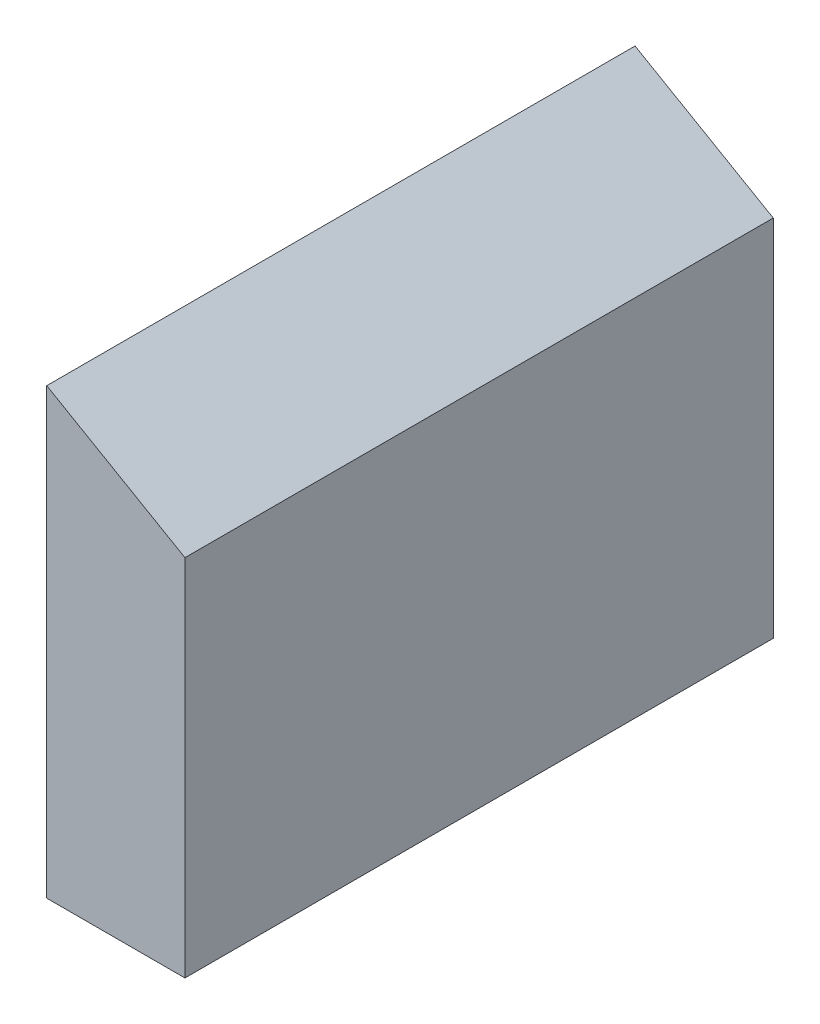
ISO-10303-21;
HEADER;
FILE_DESCRIPTION(('STEP AP214'),'2;1');
FILE_NAME('part.step','',(''),(''),'','','');
FILE_SCHEMA(('AUTOMOTIVE_DESIGN { 1 0 10303 214 1 1 1 1 }'));
ENDSEC;
DATA;
#1=APPLICATION_CONTEXT('core data for automotive mechanical design processes');
#2=APPLICATION_PROTOCOL_DEFINITION('international standard','automotive_design',2000,#1);
#3=PRODUCT_CONTEXT('',#1,'mechanical');
#4=PRODUCT('Part','Part','',(#3));
#5=PRODUCT_RELATED_PRODUCT_CATEGORY('part','',(#4));
#6=PRODUCT_DEFINITION_FORMATION('','',#4);
#7=PRODUCT_DEFINITION_CONTEXT('part definition',#1,'design');
#8=PRODUCT_DEFINITION('design','',#6,#7);
#9=PRODUCT_DEFINITION_SHAPE('','',#8);
#10=(LENGTH_UNIT() NAMED_UNIT(*) SI_UNIT(.MILLI.,.METRE.));
#11=(NAMED_UNIT(*) PLANE_ANGLE_UNIT() SI_UNIT($,.RADIAN.));
#12=(NAMED_UNIT(*) SI_UNIT($,.STERADIAN.) SOLID_ANGLE_UNIT());
#13=UNCERTAINTY_MEASURE_WITH_UNIT(LENGTH_MEASURE(1.E-05),#10,'distance_accuracy_value','');
#14=(GEOMETRIC_REPRESENTATION_CONTEXT(3) GLOBAL_UNCERTAINTY_ASSIGNED_CONTEXT((#13)) GLOBAL_UNIT_ASSIGNED_CONTEXT((#10,
#11,#12)) REPRESENTATION_CONTEXT('',''));
#15=CARTESIAN_POINT('',(0.,0.,0.));
#16=DIRECTION('',(0.,0.,1.));
#17=DIRECTION('',(1.,0.,0.));
#18=AXIS2_PLACEMENT_3D('',#15,#16,#17);
#19=CARTESIAN_POINT('',(0.,0.,42.57));
#20=DIRECTION('',(1.,0.,0.));
#21=DIRECTION('',(0.,0.,-1.));
#22=AXIS2_PLACEMENT_3D('',#19,#20,#21);
#23=PLANE('',#22);
#24=DIRECTION('',(0.,-1.,0.));
#25=VECTOR('',#24,1.);
#26=CARTESIAN_POINT('',(0.,0.,0.));
#27=LINE('',#26,#25);
#28=CARTESIAN_POINT('',(0.,32.118,0.));
#29=VERTEX_POINT('',#28);
#30=CARTESIAN_POINT('',(0.,0.,0.));
#31=VERTEX_POINT('',#30);
#32=EDGE_CURVE('E111',#29,#31,#27,.T.);
#33=ORIENTED_EDGE('',*,*,#32,.T.);
#34=DIRECTION('',(0.,0.,-1.));
#35=VECTOR('',#34,1.);
#36=CARTESIAN_POINT('',(0.,0.,42.57));
#37=LINE('',#36,#35);
#38=CARTESIAN_POINT('',(0.,0.,42.57));
#39=VERTEX_POINT('',#38);
#40=EDGE_CURVE('E11',#39,#31,#37,.T.);
#41=ORIENTED_EDGE('',*,*,#40,.F.);
#42=DIRECTION('',(0.,-1.,0.));
#43=VECTOR('',#42,1.);
#44=CARTESIAN_POINT('',(0.,0.,42.57));
#45=LINE('',#44,#43);
#46=CARTESIAN_POINT('',(0.,32.118,42.57));
#47=VERTEX_POINT('',#46);
#48=EDGE_CURVE('E95',#47,#39,#45,.T.);
#49=ORIENTED_EDGE('',*,*,#48,.F.);
#50=DIRECTION('',(0.,0.,-1.));
#51=VECTOR('',#50,1.);
#52=CARTESIAN_POINT('',(0.,32.118,42.57));
#53=LINE('',#52,#51);
#54=EDGE_CURVE('E107',#47,#29,#53,.T.);
#55=ORIENTED_EDGE('',*,*,#54,.T.);
#56=EDGE_LOOP('',(#33,#41,#49,#55));
#57=FACE_BOUND('',#56,.T.);
#58=ADVANCED_FACE('F43',(#57),#23,.F.);
#59=CARTESIAN_POINT('',(0.,0.,42.57));
#60=DIRECTION('',(0.,1.,0.));
#61=DIRECTION('',(0.,0.,1.));
#62=AXIS2_PLACEMENT_3D('',#59,#60,#61);
#63=PLANE('',#62);
#64=DIRECTION('',(1.,0.,0.));
#65=VECTOR('',#64,1.);
#66=CARTESIAN_POINT('',(0.,0.,0.));
#67=LINE('',#66,#65);
#68=CARTESIAN_POINT('',(10.,0.,0.));
#69=VERTEX_POINT('',#68);
#70=EDGE_CURVE('E100',#31,#69,#67,.T.);
#71=ORIENTED_EDGE('',*,*,#70,.T.);
#72=DIRECTION('',(0.,0.,-1.));
#73=VECTOR('',#72,1.);
#74=CARTESIAN_POINT('',(10.,0.,42.57));
#75=LINE('',#74,#73);
#76=CARTESIAN_POINT('',(10.,0.,42.57));
#77=VERTEX_POINT('',#76);
#78=EDGE_CURVE('E52',#77,#69,#75,.T.);
#79=ORIENTED_EDGE('',*,*,#78,.F.);
#80=DIRECTION('',(1.,0.,0.));
#81=VECTOR('',#80,1.);
#82=CARTESIAN_POINT('',(0.,0.,42.57));
#83=LINE('',#82,#81);
#84=EDGE_CURVE('E90',#39,#77,#83,.T.);
#85=ORIENTED_EDGE('',*,*,#84,.F.);
#86=ORIENTED_EDGE('',*,*,#40,.T.);
#87=EDGE_LOOP('',(#71,#79,#85,#86));
#88=FACE_BOUND('',#87,.T.);
#89=ADVANCED_FACE('F99',(#88),#63,.F.);
#90=CARTESIAN_POINT('',(10.,26.34,42.57));
#91=DIRECTION('',(-1.,0.,0.));
#92=DIRECTION('',(0.,0.,1.));
#93=AXIS2_PLACEMENT_3D('',#90,#91,#92);
#94=PLANE('',#93);
#95=DIRECTION('',(0.,1.,0.));
#96=VECTOR('',#95,1.);
#97=CARTESIAN_POINT('',(10.,26.34,0.));
#98=LINE('',#97,#96);
#99=CARTESIAN_POINT('',(10.,26.34,0.));
#100=VERTEX_POINT('',#99);
#101=EDGE_CURVE('E77',#69,#100,#98,.T.);
#102=ORIENTED_EDGE('',*,*,#101,.T.);
#103=DIRECTION('',(0.,0.,-1.));
#104=VECTOR('',#103,1.);
#105=CARTESIAN_POINT('',(10.,26.34,42.57));
#106=LINE('',#105,#104);
#107=CARTESIAN_POINT('',(10.,26.34,42.57));
#108=VERTEX_POINT('',#107);
#109=EDGE_CURVE('E102',#108,#100,#106,.T.);
#110=ORIENTED_EDGE('',*,*,#109,.F.);
#111=DIRECTION('',(0.,1.,0.));
#112=VECTOR('',#111,1.);
#113=CARTESIAN_POINT('',(10.,26.34,42.57));
#114=LINE('',#113,#112);
#115=EDGE_CURVE('E93',#77,#108,#114,.T.);
#116=ORIENTED_EDGE('',*,*,#115,.F.);
#117=ORIENTED_EDGE('',*,*,#78,.T.);
#118=EDGE_LOOP('',(#102,#110,#116,#117));
#119=FACE_BOUND('',#118,.T.);
#120=ADVANCED_FACE('F103',(#119),#94,.F.);
#121=CARTESIAN_POINT('',(0.,32.118,42.57));
#122=DIRECTION('',(-0.50029202340802,-0.865856738331641,0.));
#123=DIRECTION('',(0.865856738331642,-0.50029202340802,0.));
#124=AXIS2_PLACEMENT_3D('',#121,#122,#123);
#125=PLANE('',#124);
#126=DIRECTION('',(-0.865856738331642,0.50029202340802,0.));
#127=VECTOR('',#126,1.);
#128=CARTESIAN_POINT('',(0.,32.118,0.));
#129=LINE('',#128,#127);
#130=EDGE_CURVE('E83',#100,#29,#129,.T.);
#131=ORIENTED_EDGE('',*,*,#130,.T.);
#132=ORIENTED_EDGE('',*,*,#54,.F.);
#133=DIRECTION('',(-0.865856738331642,0.50029202340802,0.));
#134=VECTOR('',#133,1.);
#135=CARTESIAN_POINT('',(0.,32.118,42.57));
#136=LINE('',#135,#134);
#137=EDGE_CURVE('E60',#108,#47,#136,.T.);
#138=ORIENTED_EDGE('',*,*,#137,.F.);
#139=ORIENTED_EDGE('',*,*,#109,.T.);
#140=EDGE_LOOP('',(#131,#132,#138,#139));
#141=FACE_BOUND('',#140,.T.);
#142=ADVANCED_FACE('F124',(#141),#125,.F.);
#143=CARTESIAN_POINT('',(0.,0.,42.57));
#144=DIRECTION('',(0.,0.,-1.));
#145=DIRECTION('',(-1.,0.,0.));
#146=AXIS2_PLACEMENT_3D('',#143,#144,#145);
#147=PLANE('',#146);
#148=ORIENTED_EDGE('',*,*,#48,.T.);
#149=ORIENTED_EDGE('',*,*,#84,.T.);
#150=ORIENTED_EDGE('',*,*,#115,.T.);
#151=ORIENTED_EDGE('',*,*,#137,.T.);
#152=EDGE_LOOP('',(#148,#149,#150,#151));
#153=FACE_BOUND('',#152,.T.);
#154=ADVANCED_FACE('F91',(#153),#147,.F.);
#155=CARTESIAN_POINT('',(0.,0.,0.));
#156=DIRECTION('',(0.,0.,-1.));
#157=DIRECTION('',(-1.,0.,0.));
#158=AXIS2_PLACEMENT_3D('',#155,#156,#157);
#159=PLANE('',#158);
#160=ORIENTED_EDGE('',*,*,#32,.F.);
#161=ORIENTED_EDGE('',*,*,#130,.F.);
#162=ORIENTED_EDGE('',*,*,#101,.F.);
#163=ORIENTED_EDGE('',*,*,#70,.F.);
#164=EDGE_LOOP('',(#160,#161,#162,#163));
#165=FACE_BOUND('',#164,.T.);
#166=ADVANCED_FACE('F127',(#165),#159,.T.);
#167=CLOSED_SHELL('',(#58,#89,#120,#142,#154,#166));
#168=MANIFOLD_SOLID_BREP('B2',#167);
#169=ADVANCED_BREP_SHAPE_REPRESENTATION('',(#18,#168),#14);
#170=SHAPE_DEFINITION_REPRESENTATION(#9,#169);
ENDSEC;
END-ISO-10303-21;
